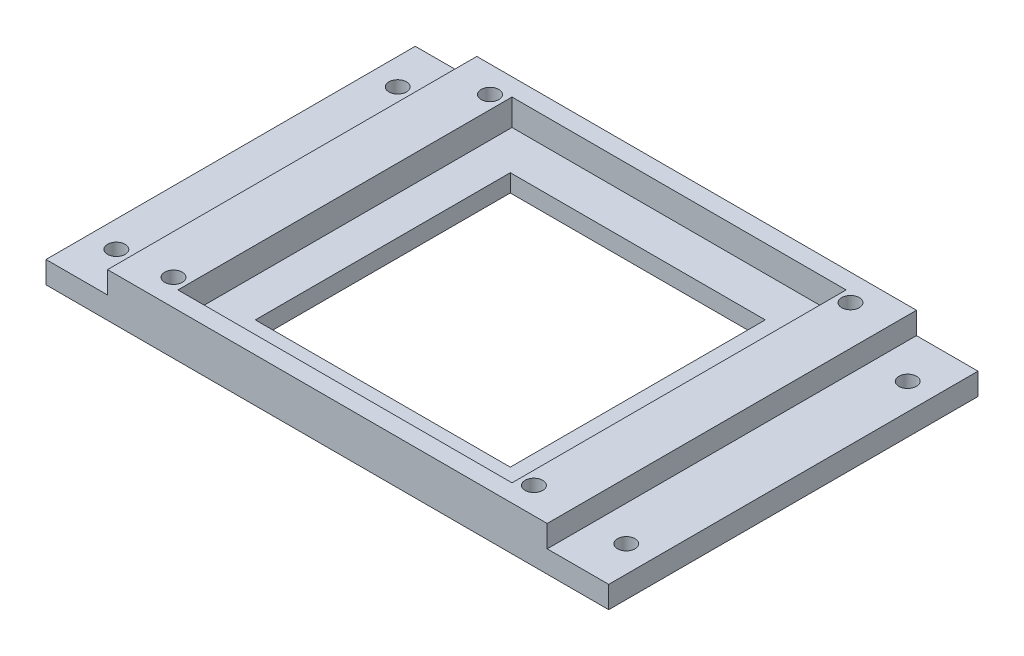
ISO-10303-21;
HEADER;
FILE_DESCRIPTION(('STEP AP214'),'2;1');
FILE_NAME('part.step','',(''),(''),'','','');
FILE_SCHEMA(('AUTOMOTIVE_DESIGN { 1 0 10303 214 1 1 1 1 }'));
ENDSEC;
DATA;
#1=APPLICATION_CONTEXT('core data for automotive mechanical design processes');
#2=APPLICATION_PROTOCOL_DEFINITION('international standard','automotive_design',2000,#1);
#3=PRODUCT_CONTEXT('',#1,'mechanical');
#4=PRODUCT('Part','Part','',(#3));
#5=PRODUCT_RELATED_PRODUCT_CATEGORY('part','',(#4));
#6=PRODUCT_DEFINITION_FORMATION('','',#4);
#7=PRODUCT_DEFINITION_CONTEXT('part definition',#1,'design');
#8=PRODUCT_DEFINITION('design','',#6,#7);
#9=PRODUCT_DEFINITION_SHAPE('','',#8);
#10=(LENGTH_UNIT() NAMED_UNIT(*) SI_UNIT(.MILLI.,.METRE.));
#11=(NAMED_UNIT(*) PLANE_ANGLE_UNIT() SI_UNIT($,.RADIAN.));
#12=(NAMED_UNIT(*) SI_UNIT($,.STERADIAN.) SOLID_ANGLE_UNIT());
#13=UNCERTAINTY_MEASURE_WITH_UNIT(LENGTH_MEASURE(1.E-05),#10,'distance_accuracy_value','');
#14=(GEOMETRIC_REPRESENTATION_CONTEXT(3) GLOBAL_UNCERTAINTY_ASSIGNED_CONTEXT((#13)) GLOBAL_UNIT_ASSIGNED_CONTEXT((#10,
#11,#12)) REPRESENTATION_CONTEXT('',''));
#15=CARTESIAN_POINT('',(0.,0.,0.));
#16=DIRECTION('',(0.,0.,1.));
#17=DIRECTION('',(1.,0.,0.));
#18=AXIS2_PLACEMENT_3D('',#15,#16,#17);
#19=CARTESIAN_POINT('',(10.,30.,11.));
#20=DIRECTION('',(0.,-1.,0.));
#21=DIRECTION('',(0.,0.,-1.));
#22=AXIS2_PLACEMENT_3D('',#19,#20,#21);
#23=PLANE('',#22);
#24=CARTESIAN_POINT('',(-42.5,30.,18.002647660039));
#25=DIRECTION('',(0.,1.,0.));
#26=DIRECTION('',(0.,0.,1.));
#27=AXIS2_PLACEMENT_3D('',#24,#25,#26);
#28=CIRCLE('',#27,1.00264766003897);
#29=CARTESIAN_POINT('',(-42.5,30.,19.0052953200779));
#30=VERTEX_POINT('',#29);
#31=EDGE_CURVE('E325',#30,#30,#28,.T.);
#32=ORIENTED_EDGE('',*,*,#31,.F.);
#33=EDGE_LOOP('',(#32));
#34=FACE_BOUND('',#33,.T.);
#35=CARTESIAN_POINT('',(-42.5,30.,-17.997352339961));
#36=DIRECTION('',(0.,1.,0.));
#37=DIRECTION('',(0.,0.,1.));
#38=AXIS2_PLACEMENT_3D('',#35,#36,#37);
#39=CIRCLE('',#38,1.00264766003897);
#40=CARTESIAN_POINT('',(-42.5,30.,-16.9947046799221));
#41=VERTEX_POINT('',#40);
#42=EDGE_CURVE('E319',#41,#41,#39,.T.);
#43=ORIENTED_EDGE('',*,*,#42,.F.);
#44=EDGE_LOOP('',(#43));
#45=FACE_BOUND('',#44,.T.);
#46=DIRECTION('',(1.,0.,0.));
#47=VECTOR('',#46,1.);
#48=CARTESIAN_POINT('',(-41.,30.,19.));
#49=LINE('',#48,#47);
#50=CARTESIAN_POINT('',(-41.,30.,19.));
#51=VERTEX_POINT('',#50);
#52=CARTESIAN_POINT('',(-3.00000000000001,30.,19.));
#53=VERTEX_POINT('',#52);
#54=EDGE_CURVE('E279',#51,#53,#49,.T.);
#55=ORIENTED_EDGE('',*,*,#54,.F.);
#56=DIRECTION('',(0.,0.,1.));
#57=VECTOR('',#56,1.);
#58=CARTESIAN_POINT('',(-41.,30.,-19.));
#59=LINE('',#58,#57);
#60=CARTESIAN_POINT('',(-41.,30.,-19.));
#61=VERTEX_POINT('',#60);
#62=EDGE_CURVE('E258',#61,#51,#59,.T.);
#63=ORIENTED_EDGE('',*,*,#62,.F.);
#64=DIRECTION('',(-1.,0.,0.));
#65=VECTOR('',#64,1.);
#66=CARTESIAN_POINT('',(-41.,30.,-19.));
#67=LINE('',#66,#65);
#68=CARTESIAN_POINT('',(-3.00000000000001,30.,-19.));
#69=VERTEX_POINT('',#68);
#70=EDGE_CURVE('E268',#69,#61,#67,.T.);
#71=ORIENTED_EDGE('',*,*,#70,.F.);
#72=DIRECTION('',(0.,0.,-1.));
#73=VECTOR('',#72,1.);
#74=CARTESIAN_POINT('',(-3.00000000000001,30.,-19.));
#75=LINE('',#74,#73);
#76=EDGE_CURVE('E282',#53,#69,#75,.T.);
#77=ORIENTED_EDGE('',*,*,#76,.F.);
#78=EDGE_LOOP('',(#55,#63,#71,#77));
#79=FACE_BOUND('',#78,.T.);
#80=CARTESIAN_POINT('',(-1.50000000000001,30.,-17.997352339961));
#81=DIRECTION('',(0.,1.,0.));
#82=DIRECTION('',(0.,0.,1.));
#83=AXIS2_PLACEMENT_3D('',#80,#81,#82);
#84=CIRCLE('',#83,1.00264766003897);
#85=CARTESIAN_POINT('',(-1.50000000000001,30.,-16.9947046799221));
#86=VERTEX_POINT('',#85);
#87=EDGE_CURVE('E227',#86,#86,#84,.T.);
#88=ORIENTED_EDGE('',*,*,#87,.F.);
#89=EDGE_LOOP('',(#88));
#90=FACE_BOUND('',#89,.T.);
#91=CARTESIAN_POINT('',(-1.50000000000001,30.,18.002647660039));
#92=DIRECTION('',(0.,1.,0.));
#93=DIRECTION('',(0.,0.,1.));
#94=AXIS2_PLACEMENT_3D('',#91,#92,#93);
#95=CIRCLE('',#94,1.00264766003897);
#96=CARTESIAN_POINT('',(-1.50000000000001,30.,19.0052953200779));
#97=VERTEX_POINT('',#96);
#98=EDGE_CURVE('E221',#97,#97,#95,.T.);
#99=ORIENTED_EDGE('',*,*,#98,.F.);
#100=EDGE_LOOP('',(#99));
#101=FACE_BOUND('',#100,.T.);
#102=DIRECTION('',(-1.,0.,0.));
#103=VECTOR('',#102,1.);
#104=CARTESIAN_POINT('',(0.,30.,21.));
#105=LINE('',#104,#103);
#106=CARTESIAN_POINT('',(3.00207808737696,30.,21.));
#107=VERTEX_POINT('',#106);
#108=CARTESIAN_POINT('',(-47.0017152972986,30.,21.));
#109=VERTEX_POINT('',#108);
#110=EDGE_CURVE('E314',#107,#109,#105,.T.);
#111=ORIENTED_EDGE('',*,*,#110,.F.);
#112=DIRECTION('',(0.,0.,1.));
#113=VECTOR('',#112,1.);
#114=CARTESIAN_POINT('',(3.00207808737696,30.,21.));
#115=LINE('',#114,#113);
#116=CARTESIAN_POINT('',(3.00207808737696,30.,-21.));
#117=VERTEX_POINT('',#116);
#118=EDGE_CURVE('E181',#117,#107,#115,.T.);
#119=ORIENTED_EDGE('',*,*,#118,.F.);
#120=DIRECTION('',(1.,0.,0.));
#121=VECTOR('',#120,1.);
#122=CARTESIAN_POINT('',(10.,30.,-21.));
#123=LINE('',#122,#121);
#124=CARTESIAN_POINT('',(-47.0017152972986,30.,-21.));
#125=VERTEX_POINT('',#124);
#126=EDGE_CURVE('E187',#125,#117,#123,.T.);
#127=ORIENTED_EDGE('',*,*,#126,.F.);
#128=DIRECTION('',(0.,0.,-1.));
#129=VECTOR('',#128,1.);
#130=CARTESIAN_POINT('',(-47.0017152972986,30.,21.));
#131=LINE('',#130,#129);
#132=EDGE_CURVE('E189',#109,#125,#131,.T.);
#133=ORIENTED_EDGE('',*,*,#132,.F.);
#134=EDGE_LOOP('',(#111,#119,#127,#133));
#135=FACE_BOUND('',#134,.T.);
#136=ADVANCED_FACE('F46',(#34,#45,#79,#90,#101,#135),#23,.F.);
#137=CARTESIAN_POINT('',(-51.,25.,16.));
#138=DIRECTION('',(0.,1.,0.));
#139=DIRECTION('',(0.,0.,1.));
#140=AXIS2_PLACEMENT_3D('',#137,#138,#139);
#141=CYLINDRICAL_SURFACE('',#140,1.);
#142=CARTESIAN_POINT('',(-51.,27.5,16.));
#143=DIRECTION('',(0.,-1.,0.));
#144=DIRECTION('',(0.,0.,-1.));
#145=AXIS2_PLACEMENT_3D('',#142,#143,#144);
#146=CIRCLE('',#145,1.);
#147=CARTESIAN_POINT('',(-51.,27.5,15.));
#148=VERTEX_POINT('',#147);
#149=EDGE_CURVE('E207',#148,#148,#146,.F.);
#150=ORIENTED_EDGE('',*,*,#149,.T.);
#151=EDGE_LOOP('',(#150));
#152=FACE_BOUND('',#151,.T.);
#153=CARTESIAN_POINT('',(-51.,25.,16.));
#154=DIRECTION('',(0.,1.,0.));
#155=DIRECTION('',(0.,0.,1.));
#156=AXIS2_PLACEMENT_3D('',#153,#154,#155);
#157=CIRCLE('',#156,1.);
#158=CARTESIAN_POINT('',(-51.,25.,17.));
#159=VERTEX_POINT('',#158);
#160=EDGE_CURVE('E12',#159,#159,#157,.T.);
#161=ORIENTED_EDGE('',*,*,#160,.F.);
#162=EDGE_LOOP('',(#161));
#163=FACE_BOUND('',#162,.T.);
#164=ADVANCED_FACE('F48',(#152,#163),#141,.F.);
#165=CARTESIAN_POINT('',(7.,25.,16.));
#166=DIRECTION('',(0.,1.,0.));
#167=DIRECTION('',(0.,0.,1.));
#168=AXIS2_PLACEMENT_3D('',#165,#166,#167);
#169=CYLINDRICAL_SURFACE('',#168,1.);
#170=CARTESIAN_POINT('',(7.,27.5,16.));
#171=DIRECTION('',(0.,-1.,0.));
#172=DIRECTION('',(0.,0.,-1.));
#173=AXIS2_PLACEMENT_3D('',#170,#171,#172);
#174=CIRCLE('',#173,1.);
#175=CARTESIAN_POINT('',(7.,27.5,15.));
#176=VERTEX_POINT('',#175);
#177=EDGE_CURVE('E212',#176,#176,#174,.F.);
#178=ORIENTED_EDGE('',*,*,#177,.T.);
#179=EDGE_LOOP('',(#178));
#180=FACE_BOUND('',#179,.T.);
#181=CARTESIAN_POINT('',(7.,25.,16.));
#182=DIRECTION('',(0.,1.,0.));
#183=DIRECTION('',(0.,0.,1.));
#184=AXIS2_PLACEMENT_3D('',#181,#182,#183);
#185=CIRCLE('',#184,1.);
#186=CARTESIAN_POINT('',(7.,25.,17.));
#187=VERTEX_POINT('',#186);
#188=EDGE_CURVE('E55',#187,#187,#185,.T.);
#189=ORIENTED_EDGE('',*,*,#188,.F.);
#190=EDGE_LOOP('',(#189));
#191=FACE_BOUND('',#190,.T.);
#192=ADVANCED_FACE('F359',(#180,#191),#169,.F.);
#193=CARTESIAN_POINT('',(-42.5,27.,18.002647660039));
#194=DIRECTION('',(0.,1.,0.));
#195=DIRECTION('',(0.,0.,1.));
#196=AXIS2_PLACEMENT_3D('',#193,#194,#195);
#197=PLANE('',#196);
#198=CARTESIAN_POINT('',(-42.5,27.,18.002647660039));
#199=DIRECTION('',(0.,1.,0.));
#200=DIRECTION('',(0.,0.,1.));
#201=AXIS2_PLACEMENT_3D('',#198,#199,#200);
#202=CIRCLE('',#201,1.00264766003897);
#203=CARTESIAN_POINT('',(-42.5,27.,19.0052953200779));
#204=VERTEX_POINT('',#203);
#205=EDGE_CURVE('E328',#204,#204,#202,.T.);
#206=ORIENTED_EDGE('',*,*,#205,.T.);
#207=EDGE_LOOP('',(#206));
#208=FACE_BOUND('',#207,.T.);
#209=ADVANCED_FACE('F382',(#208),#197,.T.);
#210=CARTESIAN_POINT('',(-42.5,27.,18.002647660039));
#211=DIRECTION('',(0.,1.,0.));
#212=DIRECTION('',(0.,0.,1.));
#213=AXIS2_PLACEMENT_3D('',#210,#211,#212);
#214=CYLINDRICAL_SURFACE('',#213,1.00264766003897);
#215=ORIENTED_EDGE('',*,*,#205,.F.);
#216=EDGE_LOOP('',(#215));
#217=FACE_BOUND('',#216,.T.);
#218=ORIENTED_EDGE('',*,*,#31,.T.);
#219=EDGE_LOOP('',(#218));
#220=FACE_BOUND('',#219,.T.);
#221=ADVANCED_FACE('F378',(#217,#220),#214,.F.);
#222=CARTESIAN_POINT('',(-42.5,27.,-17.997352339961));
#223=DIRECTION('',(0.,1.,0.));
#224=DIRECTION('',(0.,0.,1.));
#225=AXIS2_PLACEMENT_3D('',#222,#223,#224);
#226=PLANE('',#225);
#227=CARTESIAN_POINT('',(-42.5,27.,-17.997352339961));
#228=DIRECTION('',(0.,1.,0.));
#229=DIRECTION('',(0.,0.,1.));
#230=AXIS2_PLACEMENT_3D('',#227,#228,#229);
#231=CIRCLE('',#230,1.00264766003897);
#232=CARTESIAN_POINT('',(-42.5,27.,-16.9947046799221));
#233=VERTEX_POINT('',#232);
#234=EDGE_CURVE('E322',#233,#233,#231,.T.);
#235=ORIENTED_EDGE('',*,*,#234,.T.);
#236=EDGE_LOOP('',(#235));
#237=FACE_BOUND('',#236,.T.);
#238=ADVANCED_FACE('F374',(#237),#226,.T.);
#239=CARTESIAN_POINT('',(-42.5,27.,-17.997352339961));
#240=DIRECTION('',(0.,1.,0.));
#241=DIRECTION('',(0.,0.,1.));
#242=AXIS2_PLACEMENT_3D('',#239,#240,#241);
#243=CYLINDRICAL_SURFACE('',#242,1.00264766003897);
#244=ORIENTED_EDGE('',*,*,#234,.F.);
#245=EDGE_LOOP('',(#244));
#246=FACE_BOUND('',#245,.T.);
#247=ORIENTED_EDGE('',*,*,#42,.T.);
#248=EDGE_LOOP('',(#247));
#249=FACE_BOUND('',#248,.T.);
#250=ADVANCED_FACE('F370',(#246,#249),#243,.F.);
#251=CARTESIAN_POINT('',(10.,0.,0.));
#252=DIRECTION('',(1.,0.,0.));
#253=DIRECTION('',(0.,0.,-1.));
#254=AXIS2_PLACEMENT_3D('',#251,#252,#253);
#255=PLANE('',#254);
#256=DIRECTION('',(0.,0.,-1.));
#257=VECTOR('',#256,1.);
#258=CARTESIAN_POINT('',(10.,27.5,-21.));
#259=LINE('',#258,#257);
#260=CARTESIAN_POINT('',(10.,27.5,21.));
#261=VERTEX_POINT('',#260);
#262=CARTESIAN_POINT('',(10.,27.5,-21.));
#263=VERTEX_POINT('',#262);
#264=EDGE_CURVE('E167',#261,#263,#259,.T.);
#265=ORIENTED_EDGE('',*,*,#264,.F.);
#266=DIRECTION('',(0.,1.,0.));
#267=VECTOR('',#266,1.);
#268=CARTESIAN_POINT('',(10.,30.,21.));
#269=LINE('',#268,#267);
#270=CARTESIAN_POINT('',(10.,25.,21.));
#271=VERTEX_POINT('',#270);
#272=EDGE_CURVE('E311',#271,#261,#269,.T.);
#273=ORIENTED_EDGE('',*,*,#272,.F.);
#274=DIRECTION('',(0.,0.,-1.));
#275=VECTOR('',#274,1.);
#276=CARTESIAN_POINT('',(10.,25.,21.));
#277=LINE('',#276,#275);
#278=CARTESIAN_POINT('',(10.,25.,-21.));
#279=VERTEX_POINT('',#278);
#280=EDGE_CURVE('E316',#271,#279,#277,.T.);
#281=ORIENTED_EDGE('',*,*,#280,.T.);
#282=DIRECTION('',(0.,-1.,0.));
#283=VECTOR('',#282,1.);
#284=CARTESIAN_POINT('',(10.,30.,-21.));
#285=LINE('',#284,#283);
#286=EDGE_CURVE('E303',#263,#279,#285,.T.);
#287=ORIENTED_EDGE('',*,*,#286,.F.);
#288=EDGE_LOOP('',(#265,#273,#281,#287));
#289=FACE_BOUND('',#288,.T.);
#290=ADVANCED_FACE('F367',(#289),#255,.T.);
#291=CARTESIAN_POINT('',(0.,25.,21.));
#292=DIRECTION('',(0.,1.,0.));
#293=DIRECTION('',(0.,0.,1.));
#294=AXIS2_PLACEMENT_3D('',#291,#292,#293);
#295=PLANE('',#294);
#296=CARTESIAN_POINT('',(-51.,25.,-16.));
#297=DIRECTION('',(0.,1.,0.));
#298=DIRECTION('',(0.,0.,1.));
#299=AXIS2_PLACEMENT_3D('',#296,#297,#298);
#300=CIRCLE('',#299,1.);
#301=CARTESIAN_POINT('',(-51.,25.,-15.));
#302=VERTEX_POINT('',#301);
#303=EDGE_CURVE('E215',#302,#302,#300,.T.);
#304=ORIENTED_EDGE('',*,*,#303,.T.);
#305=EDGE_LOOP('',(#304));
#306=FACE_BOUND('',#305,.T.);
#307=CARTESIAN_POINT('',(7.,25.,-16.));
#308=DIRECTION('',(0.,1.,0.));
#309=DIRECTION('',(0.,0.,1.));
#310=AXIS2_PLACEMENT_3D('',#307,#308,#309);
#311=CIRCLE('',#310,1.);
#312=CARTESIAN_POINT('',(7.,25.,-15.));
#313=VERTEX_POINT('',#312);
#314=EDGE_CURVE('E218',#313,#313,#311,.T.);
#315=ORIENTED_EDGE('',*,*,#314,.T.);
#316=EDGE_LOOP('',(#315));
#317=FACE_BOUND('',#316,.T.);
#318=DIRECTION('',(-1.,0.,0.));
#319=VECTOR('',#318,1.);
#320=CARTESIAN_POINT('',(10.,25.,-21.));
#321=LINE('',#320,#319);
#322=CARTESIAN_POINT('',(-54.,25.,-21.));
#323=VERTEX_POINT('',#322);
#324=EDGE_CURVE('E305',#279,#323,#321,.T.);
#325=ORIENTED_EDGE('',*,*,#324,.F.);
#326=ORIENTED_EDGE('',*,*,#280,.F.);
#327=DIRECTION('',(1.,0.,0.));
#328=VECTOR('',#327,1.);
#329=CARTESIAN_POINT('',(0.,25.,21.));
#330=LINE('',#329,#328);
#331=CARTESIAN_POINT('',(-54.,25.,21.));
#332=VERTEX_POINT('',#331);
#333=EDGE_CURVE('E309',#332,#271,#330,.T.);
#334=ORIENTED_EDGE('',*,*,#333,.F.);
#335=DIRECTION('',(0.,0.,1.));
#336=VECTOR('',#335,1.);
#337=CARTESIAN_POINT('',(-54.,25.,-21.));
#338=LINE('',#337,#336);
#339=EDGE_CURVE('E297',#323,#332,#338,.T.);
#340=ORIENTED_EDGE('',*,*,#339,.F.);
#341=EDGE_LOOP('',(#325,#326,#334,#340));
#342=FACE_BOUND('',#341,.T.);
#343=DIRECTION('',(1.,0.,0.));
#344=VECTOR('',#343,1.);
#345=CARTESIAN_POINT('',(-36.6449502720448,25.,14.549169749019));
#346=LINE('',#345,#344);
#347=CARTESIAN_POINT('',(-36.6449502720448,25.,14.549169749019));
#348=VERTEX_POINT('',#347);
#349=CARTESIAN_POINT('',(-7.64495027204475,25.,14.549169749019));
#350=VERTEX_POINT('',#349);
#351=EDGE_CURVE('E244',#348,#350,#346,.T.);
#352=ORIENTED_EDGE('',*,*,#351,.T.);
#353=DIRECTION('',(0.,0.,-1.));
#354=VECTOR('',#353,1.);
#355=CARTESIAN_POINT('',(-7.64495027204475,25.,14.549169749019));
#356=LINE('',#355,#354);
#357=CARTESIAN_POINT('',(-7.64495027204475,25.,-14.450830250981));
#358=VERTEX_POINT('',#357);
#359=EDGE_CURVE('E234',#350,#358,#356,.T.);
#360=ORIENTED_EDGE('',*,*,#359,.T.);
#361=DIRECTION('',(-1.,0.,0.));
#362=VECTOR('',#361,1.);
#363=CARTESIAN_POINT('',(-36.6449502720448,25.,-14.450830250981));
#364=LINE('',#363,#362);
#365=CARTESIAN_POINT('',(-36.6449502720448,25.,-14.450830250981));
#366=VERTEX_POINT('',#365);
#367=EDGE_CURVE('E237',#358,#366,#364,.T.);
#368=ORIENTED_EDGE('',*,*,#367,.T.);
#369=DIRECTION('',(0.,0.,1.));
#370=VECTOR('',#369,1.);
#371=CARTESIAN_POINT('',(-36.6449502720448,25.,14.549169749019));
#372=LINE('',#371,#370);
#373=EDGE_CURVE('E241',#366,#348,#372,.T.);
#374=ORIENTED_EDGE('',*,*,#373,.T.);
#375=EDGE_LOOP('',(#352,#360,#368,#374));
#376=FACE_BOUND('',#375,.T.);
#377=ORIENTED_EDGE('',*,*,#188,.T.);
#378=EDGE_LOOP('',(#377));
#379=FACE_BOUND('',#378,.T.);
#380=ORIENTED_EDGE('',*,*,#160,.T.);
#381=EDGE_LOOP('',(#380));
#382=FACE_BOUND('',#381,.T.);
#383=ADVANCED_FACE('F365',(#306,#317,#342,#376,#379,#382),#295,.F.);
#384=CARTESIAN_POINT('',(0.,0.,21.));
#385=DIRECTION('',(0.,0.,1.));
#386=DIRECTION('',(1.,0.,0.));
#387=AXIS2_PLACEMENT_3D('',#384,#385,#386);
#388=PLANE('',#387);
#389=DIRECTION('',(0.,1.,0.));
#390=VECTOR('',#389,1.);
#391=CARTESIAN_POINT('',(3.00207808737696,27.5,21.));
#392=LINE('',#391,#390);
#393=CARTESIAN_POINT('',(3.00207808737696,27.5,21.));
#394=VERTEX_POINT('',#393);
#395=EDGE_CURVE('E180',#394,#107,#392,.T.);
#396=ORIENTED_EDGE('',*,*,#395,.T.);
#397=ORIENTED_EDGE('',*,*,#110,.T.);
#398=DIRECTION('',(0.,1.,0.));
#399=VECTOR('',#398,1.);
#400=CARTESIAN_POINT('',(-47.0017152972986,27.5,21.));
#401=LINE('',#400,#399);
#402=CARTESIAN_POINT('',(-47.0017152972986,27.5,21.));
#403=VERTEX_POINT('',#402);
#404=EDGE_CURVE('E195',#403,#109,#401,.T.);
#405=ORIENTED_EDGE('',*,*,#404,.F.);
#406=DIRECTION('',(-1.,0.,0.));
#407=VECTOR('',#406,1.);
#408=CARTESIAN_POINT('',(-49.,27.5,21.));
#409=LINE('',#408,#407);
#410=CARTESIAN_POINT('',(-54.,27.5,21.));
#411=VERTEX_POINT('',#410);
#412=EDGE_CURVE('E203',#403,#411,#409,.T.);
#413=ORIENTED_EDGE('',*,*,#412,.T.);
#414=DIRECTION('',(0.,1.,0.));
#415=VECTOR('',#414,1.);
#416=CARTESIAN_POINT('',(-54.,30.,21.));
#417=LINE('',#416,#415);
#418=EDGE_CURVE('E300',#332,#411,#417,.T.);
#419=ORIENTED_EDGE('',*,*,#418,.F.);
#420=ORIENTED_EDGE('',*,*,#333,.T.);
#421=ORIENTED_EDGE('',*,*,#272,.T.);
#422=DIRECTION('',(1.,0.,0.));
#423=VECTOR('',#422,1.);
#424=CARTESIAN_POINT('',(5.,27.5,21.));
#425=LINE('',#424,#423);
#426=EDGE_CURVE('E172',#394,#261,#425,.T.);
#427=ORIENTED_EDGE('',*,*,#426,.F.);
#428=EDGE_LOOP('',(#396,#397,#405,#413,#419,#420,#421,#427));
#429=FACE_BOUND('',#428,.T.);
#430=ADVANCED_FACE('F396',(#429),#388,.T.);
#431=CARTESIAN_POINT('',(0.,0.,-21.));
#432=DIRECTION('',(0.,0.,-1.));
#433=DIRECTION('',(-1.,0.,0.));
#434=AXIS2_PLACEMENT_3D('',#431,#432,#433);
#435=PLANE('',#434);
#436=DIRECTION('',(0.,1.,0.));
#437=VECTOR('',#436,1.);
#438=CARTESIAN_POINT('',(3.00207808737696,27.5,-21.));
#439=LINE('',#438,#437);
#440=CARTESIAN_POINT('',(3.00207808737696,27.5,-21.));
#441=VERTEX_POINT('',#440);
#442=EDGE_CURVE('E177',#441,#117,#439,.T.);
#443=ORIENTED_EDGE('',*,*,#442,.F.);
#444=DIRECTION('',(1.,0.,0.));
#445=VECTOR('',#444,1.);
#446=CARTESIAN_POINT('',(5.,27.5,-21.));
#447=LINE('',#446,#445);
#448=EDGE_CURVE('E161',#441,#263,#447,.T.);
#449=ORIENTED_EDGE('',*,*,#448,.T.);
#450=ORIENTED_EDGE('',*,*,#286,.T.);
#451=ORIENTED_EDGE('',*,*,#324,.T.);
#452=DIRECTION('',(0.,-1.,0.));
#453=VECTOR('',#452,1.);
#454=CARTESIAN_POINT('',(-54.,30.,-21.));
#455=LINE('',#454,#453);
#456=CARTESIAN_POINT('',(-54.,27.5,-21.));
#457=VERTEX_POINT('',#456);
#458=EDGE_CURVE('E289',#457,#323,#455,.T.);
#459=ORIENTED_EDGE('',*,*,#458,.F.);
#460=DIRECTION('',(-1.,0.,0.));
#461=VECTOR('',#460,1.);
#462=CARTESIAN_POINT('',(-49.,27.5,-21.));
#463=LINE('',#462,#461);
#464=CARTESIAN_POINT('',(-47.0017152972986,27.5,-21.));
#465=VERTEX_POINT('',#464);
#466=EDGE_CURVE('E63',#465,#457,#463,.T.);
#467=ORIENTED_EDGE('',*,*,#466,.F.);
#468=DIRECTION('',(0.,1.,0.));
#469=VECTOR('',#468,1.);
#470=CARTESIAN_POINT('',(-47.0017152972986,27.5,-21.));
#471=LINE('',#470,#469);
#472=EDGE_CURVE('E197',#465,#125,#471,.T.);
#473=ORIENTED_EDGE('',*,*,#472,.T.);
#474=ORIENTED_EDGE('',*,*,#126,.T.);
#475=EDGE_LOOP('',(#443,#449,#450,#451,#459,#467,#473,#474));
#476=FACE_BOUND('',#475,.T.);
#477=ADVANCED_FACE('F184',(#476),#435,.T.);
#478=CARTESIAN_POINT('',(-54.,0.,0.));
#479=DIRECTION('',(-1.,0.,0.));
#480=DIRECTION('',(0.,0.,1.));
#481=AXIS2_PLACEMENT_3D('',#478,#479,#480);
#482=PLANE('',#481);
#483=DIRECTION('',(0.,0.,1.));
#484=VECTOR('',#483,1.);
#485=CARTESIAN_POINT('',(-54.,27.5,-21.));
#486=LINE('',#485,#484);
#487=EDGE_CURVE('E199',#457,#411,#486,.T.);
#488=ORIENTED_EDGE('',*,*,#487,.F.);
#489=ORIENTED_EDGE('',*,*,#458,.T.);
#490=ORIENTED_EDGE('',*,*,#339,.T.);
#491=ORIENTED_EDGE('',*,*,#418,.T.);
#492=EDGE_LOOP('',(#488,#489,#490,#491));
#493=FACE_BOUND('',#492,.T.);
#494=ADVANCED_FACE('F458',(#493),#482,.T.);
#495=CARTESIAN_POINT('',(-41.,27.,-19.));
#496=DIRECTION('',(-1.,0.,0.));
#497=DIRECTION('',(0.,0.,1.));
#498=AXIS2_PLACEMENT_3D('',#495,#496,#497);
#499=PLANE('',#498);
#500=ORIENTED_EDGE('',*,*,#62,.T.);
#501=DIRECTION('',(0.,1.,0.));
#502=VECTOR('',#501,1.);
#503=CARTESIAN_POINT('',(-41.,27.,19.));
#504=LINE('',#503,#502);
#505=CARTESIAN_POINT('',(-41.,27.,19.));
#506=VERTEX_POINT('',#505);
#507=EDGE_CURVE('E277',#506,#51,#504,.T.);
#508=ORIENTED_EDGE('',*,*,#507,.F.);
#509=DIRECTION('',(0.,0.,1.));
#510=VECTOR('',#509,1.);
#511=CARTESIAN_POINT('',(-41.,27.,-19.));
#512=LINE('',#511,#510);
#513=CARTESIAN_POINT('',(-41.,27.,-19.));
#514=VERTEX_POINT('',#513);
#515=EDGE_CURVE('E264',#514,#506,#512,.T.);
#516=ORIENTED_EDGE('',*,*,#515,.F.);
#517=DIRECTION('',(0.,1.,0.));
#518=VECTOR('',#517,1.);
#519=CARTESIAN_POINT('',(-41.,27.,-19.));
#520=LINE('',#519,#518);
#521=EDGE_CURVE('E287',#514,#61,#520,.T.);
#522=ORIENTED_EDGE('',*,*,#521,.T.);
#523=EDGE_LOOP('',(#500,#508,#516,#522));
#524=FACE_BOUND('',#523,.T.);
#525=ADVANCED_FACE('F448',(#524),#499,.F.);
#526=CARTESIAN_POINT('',(-41.,27.,-19.));
#527=DIRECTION('',(0.,0.,-1.));
#528=DIRECTION('',(-1.,0.,0.));
#529=AXIS2_PLACEMENT_3D('',#526,#527,#528);
#530=PLANE('',#529);
#531=ORIENTED_EDGE('',*,*,#70,.T.);
#532=ORIENTED_EDGE('',*,*,#521,.F.);
#533=DIRECTION('',(-1.,0.,0.));
#534=VECTOR('',#533,1.);
#535=CARTESIAN_POINT('',(-41.,27.,-19.));
#536=LINE('',#535,#534);
#537=CARTESIAN_POINT('',(-3.00000000000001,27.,-19.));
#538=VERTEX_POINT('',#537);
#539=EDGE_CURVE('E274',#538,#514,#536,.T.);
#540=ORIENTED_EDGE('',*,*,#539,.F.);
#541=DIRECTION('',(0.,1.,0.));
#542=VECTOR('',#541,1.);
#543=CARTESIAN_POINT('',(-3.00000000000001,27.,-19.));
#544=LINE('',#543,#542);
#545=EDGE_CURVE('E290',#538,#69,#544,.T.);
#546=ORIENTED_EDGE('',*,*,#545,.T.);
#547=EDGE_LOOP('',(#531,#532,#540,#546));
#548=FACE_BOUND('',#547,.T.);
#549=ADVANCED_FACE('F444',(#548),#530,.F.);
#550=CARTESIAN_POINT('',(-3.00000000000001,27.,-19.));
#551=DIRECTION('',(1.,0.,0.));
#552=DIRECTION('',(0.,0.,-1.));
#553=AXIS2_PLACEMENT_3D('',#550,#551,#552);
#554=PLANE('',#553);
#555=ORIENTED_EDGE('',*,*,#76,.T.);
#556=ORIENTED_EDGE('',*,*,#545,.F.);
#557=DIRECTION('',(0.,0.,-1.));
#558=VECTOR('',#557,1.);
#559=CARTESIAN_POINT('',(-3.00000000000001,27.,-19.));
#560=LINE('',#559,#558);
#561=CARTESIAN_POINT('',(-3.00000000000001,27.,19.));
#562=VERTEX_POINT('',#561);
#563=EDGE_CURVE('E271',#562,#538,#560,.T.);
#564=ORIENTED_EDGE('',*,*,#563,.F.);
#565=DIRECTION('',(0.,1.,0.));
#566=VECTOR('',#565,1.);
#567=CARTESIAN_POINT('',(-3.00000000000001,27.,19.));
#568=LINE('',#567,#566);
#569=EDGE_CURVE('E292',#562,#53,#568,.T.);
#570=ORIENTED_EDGE('',*,*,#569,.T.);
#571=EDGE_LOOP('',(#555,#556,#564,#570));
#572=FACE_BOUND('',#571,.T.);
#573=ADVANCED_FACE('F447',(#572),#554,.F.);
#574=CARTESIAN_POINT('',(-41.,27.,19.));
#575=DIRECTION('',(0.,0.,1.));
#576=DIRECTION('',(1.,0.,0.));
#577=AXIS2_PLACEMENT_3D('',#574,#575,#576);
#578=PLANE('',#577);
#579=ORIENTED_EDGE('',*,*,#54,.T.);
#580=ORIENTED_EDGE('',*,*,#569,.F.);
#581=DIRECTION('',(1.,0.,0.));
#582=VECTOR('',#581,1.);
#583=CARTESIAN_POINT('',(-41.,27.,19.));
#584=LINE('',#583,#582);
#585=EDGE_CURVE('E267',#506,#562,#584,.T.);
#586=ORIENTED_EDGE('',*,*,#585,.F.);
#587=ORIENTED_EDGE('',*,*,#507,.T.);
#588=EDGE_LOOP('',(#579,#580,#586,#587));
#589=FACE_BOUND('',#588,.T.);
#590=ADVANCED_FACE('F442',(#589),#578,.F.);
#591=CARTESIAN_POINT('',(0.,27.,0.));
#592=DIRECTION('',(0.,1.,0.));
#593=DIRECTION('',(0.,0.,1.));
#594=AXIS2_PLACEMENT_3D('',#591,#592,#593);
#595=PLANE('',#594);
#596=DIRECTION('',(0.,0.,-1.));
#597=VECTOR('',#596,1.);
#598=CARTESIAN_POINT('',(-7.64495027204475,27.,14.549169749019));
#599=LINE('',#598,#597);
#600=CARTESIAN_POINT('',(-7.64495027204475,27.,14.549169749019));
#601=VERTEX_POINT('',#600);
#602=CARTESIAN_POINT('',(-7.64495027204475,27.,-14.450830250981));
#603=VERTEX_POINT('',#602);
#604=EDGE_CURVE('E231',#601,#603,#599,.T.);
#605=ORIENTED_EDGE('',*,*,#604,.F.);
#606=DIRECTION('',(1.,0.,0.));
#607=VECTOR('',#606,1.);
#608=CARTESIAN_POINT('',(-36.6449502720448,27.,14.549169749019));
#609=LINE('',#608,#607);
#610=CARTESIAN_POINT('',(-36.6449502720448,27.,14.549169749019));
#611=VERTEX_POINT('',#610);
#612=EDGE_CURVE('E238',#611,#601,#609,.T.);
#613=ORIENTED_EDGE('',*,*,#612,.F.);
#614=DIRECTION('',(0.,0.,1.));
#615=VECTOR('',#614,1.);
#616=CARTESIAN_POINT('',(-36.6449502720448,27.,14.549169749019));
#617=LINE('',#616,#615);
#618=CARTESIAN_POINT('',(-36.6449502720448,27.,-14.450830250981));
#619=VERTEX_POINT('',#618);
#620=EDGE_CURVE('E71',#619,#611,#617,.T.);
#621=ORIENTED_EDGE('',*,*,#620,.F.);
#622=DIRECTION('',(-1.,0.,0.));
#623=VECTOR('',#622,1.);
#624=CARTESIAN_POINT('',(-36.6449502720448,27.,-14.450830250981));
#625=LINE('',#624,#623);
#626=EDGE_CURVE('E250',#603,#619,#625,.T.);
#627=ORIENTED_EDGE('',*,*,#626,.F.);
#628=EDGE_LOOP('',(#605,#613,#621,#627));
#629=FACE_BOUND('',#628,.T.);
#630=ORIENTED_EDGE('',*,*,#515,.T.);
#631=ORIENTED_EDGE('',*,*,#585,.T.);
#632=ORIENTED_EDGE('',*,*,#563,.T.);
#633=ORIENTED_EDGE('',*,*,#539,.T.);
#634=EDGE_LOOP('',(#630,#631,#632,#633));
#635=FACE_BOUND('',#634,.T.);
#636=ADVANCED_FACE('F439',(#629,#635),#595,.T.);
#637=CARTESIAN_POINT('',(-7.64495027204475,25.,14.549169749019));
#638=DIRECTION('',(1.,0.,0.));
#639=DIRECTION('',(0.,0.,-1.));
#640=AXIS2_PLACEMENT_3D('',#637,#638,#639);
#641=PLANE('',#640);
#642=ORIENTED_EDGE('',*,*,#604,.T.);
#643=DIRECTION('',(0.,1.,0.));
#644=VECTOR('',#643,1.);
#645=CARTESIAN_POINT('',(-7.64495027204475,25.,-14.450830250981));
#646=LINE('',#645,#644);
#647=EDGE_CURVE('E247',#358,#603,#646,.T.);
#648=ORIENTED_EDGE('',*,*,#647,.F.);
#649=ORIENTED_EDGE('',*,*,#359,.F.);
#650=DIRECTION('',(0.,1.,0.));
#651=VECTOR('',#650,1.);
#652=CARTESIAN_POINT('',(-7.64495027204475,25.,14.549169749019));
#653=LINE('',#652,#651);
#654=EDGE_CURVE('E256',#350,#601,#653,.T.);
#655=ORIENTED_EDGE('',*,*,#654,.T.);
#656=EDGE_LOOP('',(#642,#648,#649,#655));
#657=FACE_BOUND('',#656,.T.);
#658=ADVANCED_FACE('F419',(#657),#641,.F.);
#659=CARTESIAN_POINT('',(-36.6449502720448,25.,14.549169749019));
#660=DIRECTION('',(0.,0.,1.));
#661=DIRECTION('',(1.,0.,0.));
#662=AXIS2_PLACEMENT_3D('',#659,#660,#661);
#663=PLANE('',#662);
#664=ORIENTED_EDGE('',*,*,#612,.T.);
#665=ORIENTED_EDGE('',*,*,#654,.F.);
#666=ORIENTED_EDGE('',*,*,#351,.F.);
#667=DIRECTION('',(0.,1.,0.));
#668=VECTOR('',#667,1.);
#669=CARTESIAN_POINT('',(-36.6449502720448,25.,14.549169749019));
#670=LINE('',#669,#668);
#671=EDGE_CURVE('E259',#348,#611,#670,.T.);
#672=ORIENTED_EDGE('',*,*,#671,.T.);
#673=EDGE_LOOP('',(#664,#665,#666,#672));
#674=FACE_BOUND('',#673,.T.);
#675=ADVANCED_FACE('F415',(#674),#663,.F.);
#676=CARTESIAN_POINT('',(-36.6449502720448,25.,14.549169749019));
#677=DIRECTION('',(-1.,0.,0.));
#678=DIRECTION('',(0.,0.,1.));
#679=AXIS2_PLACEMENT_3D('',#676,#677,#678);
#680=PLANE('',#679);
#681=ORIENTED_EDGE('',*,*,#620,.T.);
#682=ORIENTED_EDGE('',*,*,#671,.F.);
#683=ORIENTED_EDGE('',*,*,#373,.F.);
#684=DIRECTION('',(0.,1.,0.));
#685=VECTOR('',#684,1.);
#686=CARTESIAN_POINT('',(-36.6449502720448,25.,-14.450830250981));
#687=LINE('',#686,#685);
#688=EDGE_CURVE('E261',#366,#619,#687,.T.);
#689=ORIENTED_EDGE('',*,*,#688,.T.);
#690=EDGE_LOOP('',(#681,#682,#683,#689));
#691=FACE_BOUND('',#690,.T.);
#692=ADVANCED_FACE('F425',(#691),#680,.F.);
#693=CARTESIAN_POINT('',(-36.6449502720448,25.,-14.450830250981));
#694=DIRECTION('',(0.,0.,-1.));
#695=DIRECTION('',(-1.,0.,0.));
#696=AXIS2_PLACEMENT_3D('',#693,#694,#695);
#697=PLANE('',#696);
#698=ORIENTED_EDGE('',*,*,#626,.T.);
#699=ORIENTED_EDGE('',*,*,#688,.F.);
#700=ORIENTED_EDGE('',*,*,#367,.F.);
#701=ORIENTED_EDGE('',*,*,#647,.T.);
#702=EDGE_LOOP('',(#698,#699,#700,#701));
#703=FACE_BOUND('',#702,.T.);
#704=ADVANCED_FACE('F424',(#703),#697,.F.);
#705=CARTESIAN_POINT('',(-1.50000000000001,27.,-17.997352339961));
#706=DIRECTION('',(0.,1.,0.));
#707=DIRECTION('',(0.,0.,1.));
#708=AXIS2_PLACEMENT_3D('',#705,#706,#707);
#709=CYLINDRICAL_SURFACE('',#708,1.00264766003897);
#710=CARTESIAN_POINT('',(-1.50000000000001,27.,-17.997352339961));
#711=DIRECTION('',(0.,1.,0.));
#712=DIRECTION('',(0.,0.,1.));
#713=AXIS2_PLACEMENT_3D('',#710,#711,#712);
#714=CIRCLE('',#713,1.00264766003897);
#715=CARTESIAN_POINT('',(-1.50000000000001,27.,-16.9947046799221));
#716=VERTEX_POINT('',#715);
#717=EDGE_CURVE('E228',#716,#716,#714,.T.);
#718=ORIENTED_EDGE('',*,*,#717,.F.);
#719=EDGE_LOOP('',(#718));
#720=FACE_BOUND('',#719,.T.);
#721=ORIENTED_EDGE('',*,*,#87,.T.);
#722=EDGE_LOOP('',(#721));
#723=FACE_BOUND('',#722,.T.);
#724=ADVANCED_FACE('F432',(#720,#723),#709,.F.);
#725=CARTESIAN_POINT('',(-1.50000000000001,27.,-17.997352339961));
#726=DIRECTION('',(0.,1.,0.));
#727=DIRECTION('',(0.,0.,1.));
#728=AXIS2_PLACEMENT_3D('',#725,#726,#727);
#729=PLANE('',#728);
#730=ORIENTED_EDGE('',*,*,#717,.T.);
#731=EDGE_LOOP('',(#730));
#732=FACE_BOUND('',#731,.T.);
#733=ADVANCED_FACE('F556',(#732),#729,.T.);
#734=CARTESIAN_POINT('',(-1.50000000000001,27.,18.002647660039));
#735=DIRECTION('',(0.,1.,0.));
#736=DIRECTION('',(0.,0.,1.));
#737=AXIS2_PLACEMENT_3D('',#734,#735,#736);
#738=CYLINDRICAL_SURFACE('',#737,1.00264766003897);
#739=CARTESIAN_POINT('',(-1.50000000000001,27.,18.002647660039));
#740=DIRECTION('',(0.,1.,0.));
#741=DIRECTION('',(0.,0.,1.));
#742=AXIS2_PLACEMENT_3D('',#739,#740,#741);
#743=CIRCLE('',#742,1.00264766003897);
#744=CARTESIAN_POINT('',(-1.50000000000001,27.,19.0052953200779));
#745=VERTEX_POINT('',#744);
#746=EDGE_CURVE('E224',#745,#745,#743,.T.);
#747=ORIENTED_EDGE('',*,*,#746,.F.);
#748=EDGE_LOOP('',(#747));
#749=FACE_BOUND('',#748,.T.);
#750=ORIENTED_EDGE('',*,*,#98,.T.);
#751=EDGE_LOOP('',(#750));
#752=FACE_BOUND('',#751,.T.);
#753=ADVANCED_FACE('F546',(#749,#752),#738,.F.);
#754=CARTESIAN_POINT('',(-1.50000000000001,27.,18.002647660039));
#755=DIRECTION('',(0.,1.,0.));
#756=DIRECTION('',(0.,0.,1.));
#757=AXIS2_PLACEMENT_3D('',#754,#755,#756);
#758=PLANE('',#757);
#759=ORIENTED_EDGE('',*,*,#746,.T.);
#760=EDGE_LOOP('',(#759));
#761=FACE_BOUND('',#760,.T.);
#762=ADVANCED_FACE('F520',(#761),#758,.T.);
#763=CARTESIAN_POINT('',(7.,25.,-16.));
#764=DIRECTION('',(0.,1.,0.));
#765=DIRECTION('',(0.,0.,1.));
#766=AXIS2_PLACEMENT_3D('',#763,#764,#765);
#767=CYLINDRICAL_SURFACE('',#766,1.);
#768=CARTESIAN_POINT('',(7.,27.5,-16.));
#769=DIRECTION('',(0.,-1.,0.));
#770=DIRECTION('',(0.,0.,-1.));
#771=AXIS2_PLACEMENT_3D('',#768,#769,#770);
#772=CIRCLE('',#771,1.);
#773=CARTESIAN_POINT('',(7.,27.5,-17.));
#774=VERTEX_POINT('',#773);
#775=EDGE_CURVE('E171',#774,#774,#772,.F.);
#776=ORIENTED_EDGE('',*,*,#775,.T.);
#777=EDGE_LOOP('',(#776));
#778=FACE_BOUND('',#777,.T.);
#779=ORIENTED_EDGE('',*,*,#314,.F.);
#780=EDGE_LOOP('',(#779));
#781=FACE_BOUND('',#780,.T.);
#782=ADVANCED_FACE('F335',(#778,#781),#767,.F.);
#783=CARTESIAN_POINT('',(-51.,25.,-16.));
#784=DIRECTION('',(0.,1.,0.));
#785=DIRECTION('',(0.,0.,1.));
#786=AXIS2_PLACEMENT_3D('',#783,#784,#785);
#787=CYLINDRICAL_SURFACE('',#786,1.);
#788=CARTESIAN_POINT('',(-51.,27.5,-16.));
#789=DIRECTION('',(0.,-1.,0.));
#790=DIRECTION('',(0.,0.,-1.));
#791=AXIS2_PLACEMENT_3D('',#788,#789,#790);
#792=CIRCLE('',#791,1.);
#793=CARTESIAN_POINT('',(-51.,27.5,-17.));
#794=VERTEX_POINT('',#793);
#795=EDGE_CURVE('E50',#794,#794,#792,.F.);
#796=ORIENTED_EDGE('',*,*,#795,.T.);
#797=EDGE_LOOP('',(#796));
#798=FACE_BOUND('',#797,.T.);
#799=ORIENTED_EDGE('',*,*,#303,.F.);
#800=EDGE_LOOP('',(#799));
#801=FACE_BOUND('',#800,.T.);
#802=ADVANCED_FACE('F340',(#798,#801),#787,.F.);
#803=CARTESIAN_POINT('',(5.,27.5,-21.));
#804=DIRECTION('',(0.,-1.,0.));
#805=DIRECTION('',(0.,0.,-1.));
#806=AXIS2_PLACEMENT_3D('',#803,#804,#805);
#807=PLANE('',#806);
#808=ORIENTED_EDGE('',*,*,#775,.F.);
#809=EDGE_LOOP('',(#808));
#810=FACE_BOUND('',#809,.T.);
#811=ORIENTED_EDGE('',*,*,#264,.T.);
#812=ORIENTED_EDGE('',*,*,#448,.F.);
#813=DIRECTION('',(0.,0.,1.));
#814=VECTOR('',#813,1.);
#815=CARTESIAN_POINT('',(3.00207808737696,27.5,21.));
#816=LINE('',#815,#814);
#817=EDGE_CURVE('E165',#441,#394,#816,.T.);
#818=ORIENTED_EDGE('',*,*,#817,.T.);
#819=ORIENTED_EDGE('',*,*,#426,.T.);
#820=EDGE_LOOP('',(#811,#812,#818,#819));
#821=FACE_BOUND('',#820,.T.);
#822=ORIENTED_EDGE('',*,*,#177,.F.);
#823=EDGE_LOOP('',(#822));
#824=FACE_BOUND('',#823,.T.);
#825=ADVANCED_FACE('F163',(#810,#821,#824),#807,.F.);
#826=CARTESIAN_POINT('',(-49.,27.5,-21.));
#827=DIRECTION('',(0.,-1.,0.));
#828=DIRECTION('',(0.,0.,-1.));
#829=AXIS2_PLACEMENT_3D('',#826,#827,#828);
#830=PLANE('',#829);
#831=ORIENTED_EDGE('',*,*,#795,.F.);
#832=EDGE_LOOP('',(#831));
#833=FACE_BOUND('',#832,.T.);
#834=ORIENTED_EDGE('',*,*,#487,.T.);
#835=ORIENTED_EDGE('',*,*,#412,.F.);
#836=DIRECTION('',(0.,0.,-1.));
#837=VECTOR('',#836,1.);
#838=CARTESIAN_POINT('',(-47.0017152972986,27.5,21.));
#839=LINE('',#838,#837);
#840=EDGE_CURVE('E193',#403,#465,#839,.T.);
#841=ORIENTED_EDGE('',*,*,#840,.T.);
#842=ORIENTED_EDGE('',*,*,#466,.T.);
#843=EDGE_LOOP('',(#834,#835,#841,#842));
#844=FACE_BOUND('',#843,.T.);
#845=ORIENTED_EDGE('',*,*,#149,.F.);
#846=EDGE_LOOP('',(#845));
#847=FACE_BOUND('',#846,.T.);
#848=ADVANCED_FACE('F339',(#833,#844,#847),#830,.F.);
#849=CARTESIAN_POINT('',(-47.0017152972986,27.5,21.));
#850=DIRECTION('',(1.,0.,0.));
#851=DIRECTION('',(0.,0.,-1.));
#852=AXIS2_PLACEMENT_3D('',#849,#850,#851);
#853=PLANE('',#852);
#854=ORIENTED_EDGE('',*,*,#132,.T.);
#855=ORIENTED_EDGE('',*,*,#472,.F.);
#856=ORIENTED_EDGE('',*,*,#840,.F.);
#857=ORIENTED_EDGE('',*,*,#404,.T.);
#858=EDGE_LOOP('',(#854,#855,#856,#857));
#859=FACE_BOUND('',#858,.T.);
#860=ADVANCED_FACE('F346',(#859),#853,.F.);
#861=CARTESIAN_POINT('',(3.00207808737696,27.5,21.));
#862=DIRECTION('',(-1.,0.,0.));
#863=DIRECTION('',(0.,0.,1.));
#864=AXIS2_PLACEMENT_3D('',#861,#862,#863);
#865=PLANE('',#864);
#866=ORIENTED_EDGE('',*,*,#118,.T.);
#867=ORIENTED_EDGE('',*,*,#395,.F.);
#868=ORIENTED_EDGE('',*,*,#817,.F.);
#869=ORIENTED_EDGE('',*,*,#442,.T.);
#870=EDGE_LOOP('',(#866,#867,#868,#869));
#871=FACE_BOUND('',#870,.T.);
#872=ADVANCED_FACE('F176',(#871),#865,.F.);
#873=CLOSED_SHELL('',(#136,#164,#192,#209,#221,#238,#250,#290,#383,#430,#477,#494,#525,#549,
#573,#590,#636,#658,#675,#692,#704,#724,#733,#753,#762,#782,#802,#825,#848,#860,#872));
#874=MANIFOLD_SOLID_BREP('B2',#873);
#875=ADVANCED_BREP_SHAPE_REPRESENTATION('',(#18,#874),#14);
#876=SHAPE_DEFINITION_REPRESENTATION(#9,#875);
ENDSEC;
END-ISO-10303-21;
